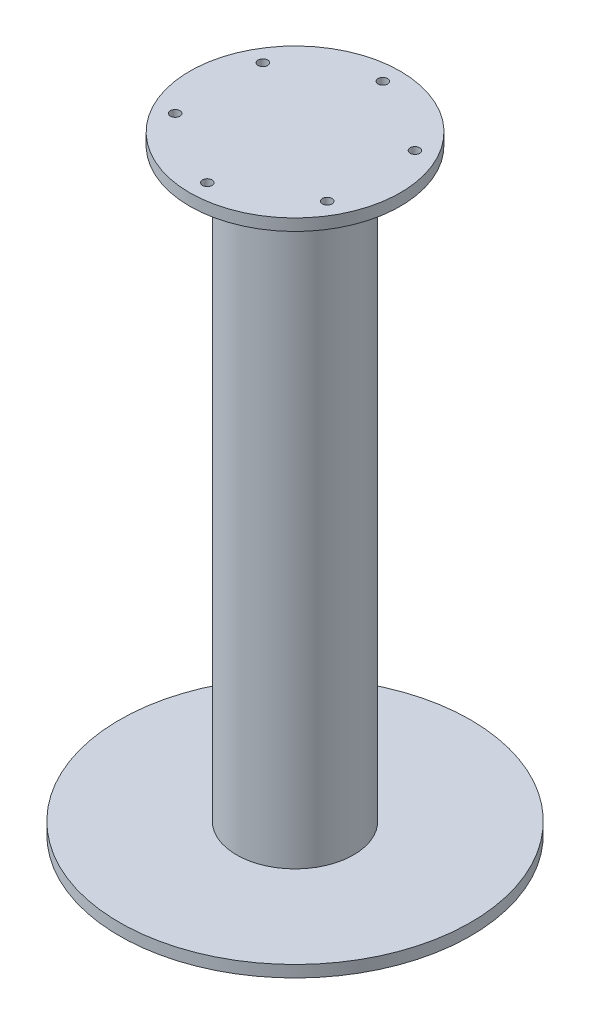
ISO-10303-21;
HEADER;
FILE_DESCRIPTION(('STEP AP214'),'2;1');
FILE_NAME('part.step','',(''),(''),'','','');
FILE_SCHEMA(('AUTOMOTIVE_DESIGN { 1 0 10303 214 1 1 1 1 }'));
ENDSEC;
DATA;
#1=APPLICATION_CONTEXT('core data for automotive mechanical design processes');
#2=APPLICATION_PROTOCOL_DEFINITION('international standard','automotive_design',2000,#1);
#3=PRODUCT_CONTEXT('',#1,'mechanical');
#4=PRODUCT('Part','Part','',(#3));
#5=PRODUCT_RELATED_PRODUCT_CATEGORY('part','',(#4));
#6=PRODUCT_DEFINITION_FORMATION('','',#4);
#7=PRODUCT_DEFINITION_CONTEXT('part definition',#1,'design');
#8=PRODUCT_DEFINITION('design','',#6,#7);
#9=PRODUCT_DEFINITION_SHAPE('','',#8);
#10=(LENGTH_UNIT() NAMED_UNIT(*) SI_UNIT(.MILLI.,.METRE.));
#11=(NAMED_UNIT(*) PLANE_ANGLE_UNIT() SI_UNIT($,.RADIAN.));
#12=(NAMED_UNIT(*) SI_UNIT($,.STERADIAN.) SOLID_ANGLE_UNIT());
#13=UNCERTAINTY_MEASURE_WITH_UNIT(LENGTH_MEASURE(1.E-05),#10,'distance_accuracy_value','');
#14=(GEOMETRIC_REPRESENTATION_CONTEXT(3) GLOBAL_UNCERTAINTY_ASSIGNED_CONTEXT((#13)) GLOBAL_UNIT_ASSIGNED_CONTEXT((#10,
#11,#12)) REPRESENTATION_CONTEXT('',''));
#15=CARTESIAN_POINT('',(0.,0.,0.));
#16=DIRECTION('',(0.,0.,1.));
#17=DIRECTION('',(1.,0.,0.));
#18=AXIS2_PLACEMENT_3D('',#15,#16,#17);
#19=CARTESIAN_POINT('',(0.,10.,0.));
#20=DIRECTION('',(0.,1.,0.));
#21=DIRECTION('',(0.,0.,1.));
#22=AXIS2_PLACEMENT_3D('',#19,#20,#21);
#23=PLANE('',#22);
#24=CARTESIAN_POINT('',(64.9519052838329,10.,-37.5));
#25=DIRECTION('',(0.,1.,0.));
#26=DIRECTION('',(0.,0.,1.));
#27=AXIS2_PLACEMENT_3D('',#24,#25,#26);
#28=CIRCLE('',#27,4.09999999999999);
#29=CARTESIAN_POINT('',(64.9519052838329,10.,-33.4));
#30=VERTEX_POINT('',#29);
#31=EDGE_CURVE('E57',#30,#30,#28,.T.);
#32=ORIENTED_EDGE('',*,*,#31,.F.);
#33=EDGE_LOOP('',(#32));
#34=FACE_BOUND('',#33,.T.);
#35=CARTESIAN_POINT('',(-64.9519052838329,10.,-37.5));
#36=DIRECTION('',(0.,1.,0.));
#37=DIRECTION('',(0.,0.,1.));
#38=AXIS2_PLACEMENT_3D('',#35,#36,#37);
#39=CIRCLE('',#38,4.09999999999999);
#40=CARTESIAN_POINT('',(-64.9519052838329,10.,-33.4));
#41=VERTEX_POINT('',#40);
#42=EDGE_CURVE('E69',#41,#41,#39,.T.);
#43=ORIENTED_EDGE('',*,*,#42,.F.);
#44=EDGE_LOOP('',(#43));
#45=FACE_BOUND('',#44,.T.);
#46=CARTESIAN_POINT('',(0.,10.,75.));
#47=DIRECTION('',(0.,1.,0.));
#48=DIRECTION('',(0.,0.,1.));
#49=AXIS2_PLACEMENT_3D('',#46,#47,#48);
#50=CIRCLE('',#49,4.1);
#51=CARTESIAN_POINT('',(0.,10.,79.1));
#52=VERTEX_POINT('',#51);
#53=EDGE_CURVE('E81',#52,#52,#50,.T.);
#54=ORIENTED_EDGE('',*,*,#53,.F.);
#55=EDGE_LOOP('',(#54));
#56=FACE_BOUND('',#55,.T.);
#57=CARTESIAN_POINT('',(0.,10.,0.));
#58=DIRECTION('',(0.,1.,0.));
#59=DIRECTION('',(0.,0.,1.));
#60=AXIS2_PLACEMENT_3D('',#57,#58,#59);
#61=CIRCLE('',#60,90.);
#62=CARTESIAN_POINT('',(0.,10.,90.));
#63=VERTEX_POINT('',#62);
#64=EDGE_CURVE('E41',#63,#63,#61,.T.);
#65=ORIENTED_EDGE('',*,*,#64,.T.);
#66=EDGE_LOOP('',(#65));
#67=FACE_BOUND('',#66,.T.);
#68=CARTESIAN_POINT('',(-64.9519052838329,10.,37.5));
#69=DIRECTION('',(0.,1.,0.));
#70=DIRECTION('',(0.,0.,1.));
#71=AXIS2_PLACEMENT_3D('',#68,#69,#70);
#72=CIRCLE('',#71,4.09999999999999);
#73=CARTESIAN_POINT('',(-64.9519052838329,10.,41.6));
#74=VERTEX_POINT('',#73);
#75=EDGE_CURVE('E75',#74,#74,#72,.T.);
#76=ORIENTED_EDGE('',*,*,#75,.F.);
#77=EDGE_LOOP('',(#76));
#78=FACE_BOUND('',#77,.T.);
#79=CARTESIAN_POINT('',(0.,10.,-75.));
#80=DIRECTION('',(0.,1.,0.));
#81=DIRECTION('',(0.,0.,1.));
#82=AXIS2_PLACEMENT_3D('',#79,#80,#81);
#83=CIRCLE('',#82,4.1);
#84=CARTESIAN_POINT('',(0.,10.,-70.9));
#85=VERTEX_POINT('',#84);
#86=EDGE_CURVE('E63',#85,#85,#83,.T.);
#87=ORIENTED_EDGE('',*,*,#86,.F.);
#88=EDGE_LOOP('',(#87));
#89=FACE_BOUND('',#88,.T.);
#90=CARTESIAN_POINT('',(64.9519052838329,10.,37.5));
#91=DIRECTION('',(0.,1.,0.));
#92=DIRECTION('',(0.,0.,1.));
#93=AXIS2_PLACEMENT_3D('',#90,#91,#92);
#94=CIRCLE('',#93,4.09999999999997);
#95=CARTESIAN_POINT('',(64.9519052838329,10.,41.5999999999999));
#96=VERTEX_POINT('',#95);
#97=EDGE_CURVE('E50',#96,#96,#94,.T.);
#98=ORIENTED_EDGE('',*,*,#97,.F.);
#99=EDGE_LOOP('',(#98));
#100=FACE_BOUND('',#99,.T.);
#101=ADVANCED_FACE('F33',(#34,#45,#56,#67,#78,#89,#100),#23,.T.);
#102=CARTESIAN_POINT('',(0.,0.,0.));
#103=DIRECTION('',(0.,1.,0.));
#104=DIRECTION('',(0.,0.,1.));
#105=AXIS2_PLACEMENT_3D('',#102,#103,#104);
#106=PLANE('',#105);
#107=CARTESIAN_POINT('',(0.,0.,0.));
#108=DIRECTION('',(0.,-1.,0.));
#109=DIRECTION('',(0.,0.,-1.));
#110=AXIS2_PLACEMENT_3D('',#107,#108,#109);
#111=CIRCLE('',#110,50.);
#112=CARTESIAN_POINT('',(0.,0.,-50.));
#113=VERTEX_POINT('',#112);
#114=EDGE_CURVE('E10',#113,#113,#111,.T.);
#115=ORIENTED_EDGE('',*,*,#114,.F.);
#116=EDGE_LOOP('',(#115));
#117=FACE_BOUND('',#116,.T.);
#118=CARTESIAN_POINT('',(0.,0.,0.));
#119=DIRECTION('',(0.,1.,0.));
#120=DIRECTION('',(0.,0.,1.));
#121=AXIS2_PLACEMENT_3D('',#118,#119,#120);
#122=CIRCLE('',#121,90.);
#123=CARTESIAN_POINT('',(0.,0.,90.));
#124=VERTEX_POINT('',#123);
#125=EDGE_CURVE('E37',#124,#124,#122,.T.);
#126=ORIENTED_EDGE('',*,*,#125,.F.);
#127=EDGE_LOOP('',(#126));
#128=FACE_BOUND('',#127,.T.);
#129=CARTESIAN_POINT('',(0.,0.,75.));
#130=DIRECTION('',(0.,1.,0.));
#131=DIRECTION('',(0.,0.,1.));
#132=AXIS2_PLACEMENT_3D('',#129,#130,#131);
#133=CIRCLE('',#132,4.1);
#134=CARTESIAN_POINT('',(0.,0.,79.1));
#135=VERTEX_POINT('',#134);
#136=EDGE_CURVE('E78',#135,#135,#133,.T.);
#137=ORIENTED_EDGE('',*,*,#136,.T.);
#138=EDGE_LOOP('',(#137));
#139=FACE_BOUND('',#138,.T.);
#140=CARTESIAN_POINT('',(-64.9519052838329,0.,37.5));
#141=DIRECTION('',(0.,1.,0.));
#142=DIRECTION('',(0.,0.,1.));
#143=AXIS2_PLACEMENT_3D('',#140,#141,#142);
#144=CIRCLE('',#143,4.09999999999999);
#145=CARTESIAN_POINT('',(-64.9519052838329,0.,41.6));
#146=VERTEX_POINT('',#145);
#147=EDGE_CURVE('E72',#146,#146,#144,.T.);
#148=ORIENTED_EDGE('',*,*,#147,.T.);
#149=EDGE_LOOP('',(#148));
#150=FACE_BOUND('',#149,.T.);
#151=CARTESIAN_POINT('',(-64.9519052838329,0.,-37.5));
#152=DIRECTION('',(0.,1.,0.));
#153=DIRECTION('',(0.,0.,1.));
#154=AXIS2_PLACEMENT_3D('',#151,#152,#153);
#155=CIRCLE('',#154,4.09999999999999);
#156=CARTESIAN_POINT('',(-64.9519052838329,0.,-33.4));
#157=VERTEX_POINT('',#156);
#158=EDGE_CURVE('E66',#157,#157,#155,.T.);
#159=ORIENTED_EDGE('',*,*,#158,.T.);
#160=EDGE_LOOP('',(#159));
#161=FACE_BOUND('',#160,.T.);
#162=CARTESIAN_POINT('',(0.,0.,-75.));
#163=DIRECTION('',(0.,1.,0.));
#164=DIRECTION('',(0.,0.,1.));
#165=AXIS2_PLACEMENT_3D('',#162,#163,#164);
#166=CIRCLE('',#165,4.1);
#167=CARTESIAN_POINT('',(0.,0.,-70.9));
#168=VERTEX_POINT('',#167);
#169=EDGE_CURVE('E60',#168,#168,#166,.T.);
#170=ORIENTED_EDGE('',*,*,#169,.T.);
#171=EDGE_LOOP('',(#170));
#172=FACE_BOUND('',#171,.T.);
#173=CARTESIAN_POINT('',(64.9519052838329,0.,-37.5));
#174=DIRECTION('',(0.,1.,0.));
#175=DIRECTION('',(0.,0.,1.));
#176=AXIS2_PLACEMENT_3D('',#173,#174,#175);
#177=CIRCLE('',#176,4.09999999999999);
#178=CARTESIAN_POINT('',(64.9519052838329,0.,-33.4));
#179=VERTEX_POINT('',#178);
#180=EDGE_CURVE('E53',#179,#179,#177,.T.);
#181=ORIENTED_EDGE('',*,*,#180,.T.);
#182=EDGE_LOOP('',(#181));
#183=FACE_BOUND('',#182,.T.);
#184=CARTESIAN_POINT('',(64.9519052838329,0.,37.5));
#185=DIRECTION('',(0.,1.,0.));
#186=DIRECTION('',(0.,0.,1.));
#187=AXIS2_PLACEMENT_3D('',#184,#185,#186);
#188=CIRCLE('',#187,4.09999999999997);
#189=CARTESIAN_POINT('',(64.9519052838329,0.,41.5999999999999));
#190=VERTEX_POINT('',#189);
#191=EDGE_CURVE('E54',#190,#190,#188,.T.);
#192=ORIENTED_EDGE('',*,*,#191,.T.);
#193=EDGE_LOOP('',(#192));
#194=FACE_BOUND('',#193,.T.);
#195=ADVANCED_FACE('F87',(#117,#128,#139,#150,#161,#172,#183,#194),#106,.F.);
#196=CARTESIAN_POINT('',(0.,10.,0.));
#197=DIRECTION('',(0.,-1.,0.));
#198=DIRECTION('',(0.,0.,-1.));
#199=AXIS2_PLACEMENT_3D('',#196,#197,#198);
#200=CYLINDRICAL_SURFACE('',#199,90.);
#201=ORIENTED_EDGE('',*,*,#64,.F.);
#202=EDGE_LOOP('',(#201));
#203=FACE_BOUND('',#202,.T.);
#204=ORIENTED_EDGE('',*,*,#125,.T.);
#205=EDGE_LOOP('',(#204));
#206=FACE_BOUND('',#205,.T.);
#207=ADVANCED_FACE('F35',(#203,#206),#200,.T.);
#208=CARTESIAN_POINT('',(0.,10.,75.));
#209=DIRECTION('',(0.,-1.,0.));
#210=DIRECTION('',(0.,0.,-1.));
#211=AXIS2_PLACEMENT_3D('',#208,#209,#210);
#212=CYLINDRICAL_SURFACE('',#211,4.1);
#213=ORIENTED_EDGE('',*,*,#53,.T.);
#214=EDGE_LOOP('',(#213));
#215=FACE_BOUND('',#214,.T.);
#216=ORIENTED_EDGE('',*,*,#136,.F.);
#217=EDGE_LOOP('',(#216));
#218=FACE_BOUND('',#217,.T.);
#219=ADVANCED_FACE('F90',(#215,#218),#212,.F.);
#220=CARTESIAN_POINT('',(-64.9519052838329,10.,37.5));
#221=DIRECTION('',(0.,-1.,0.));
#222=DIRECTION('',(0.,0.,-1.));
#223=AXIS2_PLACEMENT_3D('',#220,#221,#222);
#224=CYLINDRICAL_SURFACE('',#223,4.09999999999999);
#225=ORIENTED_EDGE('',*,*,#75,.T.);
#226=EDGE_LOOP('',(#225));
#227=FACE_BOUND('',#226,.T.);
#228=ORIENTED_EDGE('',*,*,#147,.F.);
#229=EDGE_LOOP('',(#228));
#230=FACE_BOUND('',#229,.T.);
#231=ADVANCED_FACE('F92',(#227,#230),#224,.F.);
#232=CARTESIAN_POINT('',(-64.9519052838329,10.,-37.5));
#233=DIRECTION('',(0.,-1.,0.));
#234=DIRECTION('',(0.,0.,-1.));
#235=AXIS2_PLACEMENT_3D('',#232,#233,#234);
#236=CYLINDRICAL_SURFACE('',#235,4.09999999999999);
#237=ORIENTED_EDGE('',*,*,#42,.T.);
#238=EDGE_LOOP('',(#237));
#239=FACE_BOUND('',#238,.T.);
#240=ORIENTED_EDGE('',*,*,#158,.F.);
#241=EDGE_LOOP('',(#240));
#242=FACE_BOUND('',#241,.T.);
#243=ADVANCED_FACE('F99',(#239,#242),#236,.F.);
#244=CARTESIAN_POINT('',(0.,10.,-75.));
#245=DIRECTION('',(0.,-1.,0.));
#246=DIRECTION('',(0.,0.,-1.));
#247=AXIS2_PLACEMENT_3D('',#244,#245,#246);
#248=CYLINDRICAL_SURFACE('',#247,4.1);
#249=ORIENTED_EDGE('',*,*,#86,.T.);
#250=EDGE_LOOP('',(#249));
#251=FACE_BOUND('',#250,.T.);
#252=ORIENTED_EDGE('',*,*,#169,.F.);
#253=EDGE_LOOP('',(#252));
#254=FACE_BOUND('',#253,.T.);
#255=ADVANCED_FACE('F139',(#251,#254),#248,.F.);
#256=CARTESIAN_POINT('',(64.9519052838329,10.,-37.5));
#257=DIRECTION('',(0.,-1.,0.));
#258=DIRECTION('',(0.,0.,-1.));
#259=AXIS2_PLACEMENT_3D('',#256,#257,#258);
#260=CYLINDRICAL_SURFACE('',#259,4.09999999999999);
#261=ORIENTED_EDGE('',*,*,#31,.T.);
#262=EDGE_LOOP('',(#261));
#263=FACE_BOUND('',#262,.T.);
#264=ORIENTED_EDGE('',*,*,#180,.F.);
#265=EDGE_LOOP('',(#264));
#266=FACE_BOUND('',#265,.T.);
#267=ADVANCED_FACE('F128',(#263,#266),#260,.F.);
#268=CARTESIAN_POINT('',(64.9519052838329,10.,37.5));
#269=DIRECTION('',(0.,-1.,0.));
#270=DIRECTION('',(0.,0.,-1.));
#271=AXIS2_PLACEMENT_3D('',#268,#269,#270);
#272=CYLINDRICAL_SURFACE('',#271,4.09999999999997);
#273=ORIENTED_EDGE('',*,*,#97,.T.);
#274=EDGE_LOOP('',(#273));
#275=FACE_BOUND('',#274,.T.);
#276=ORIENTED_EDGE('',*,*,#191,.F.);
#277=EDGE_LOOP('',(#276));
#278=FACE_BOUND('',#277,.T.);
#279=ADVANCED_FACE('F124',(#275,#278),#272,.F.);
#280=CARTESIAN_POINT('',(0.,-500.,0.));
#281=DIRECTION('',(0.,1.,0.));
#282=DIRECTION('',(0.,0.,1.));
#283=AXIS2_PLACEMENT_3D('',#280,#281,#282);
#284=CYLINDRICAL_SURFACE('',#283,50.);
#285=CARTESIAN_POINT('',(0.,-500.,0.));
#286=DIRECTION('',(0.,-1.,0.));
#287=DIRECTION('',(0.,0.,-1.));
#288=AXIS2_PLACEMENT_3D('',#285,#286,#287);
#289=CIRCLE('',#288,50.);
#290=CARTESIAN_POINT('',(0.,-500.,-50.));
#291=VERTEX_POINT('',#290);
#292=EDGE_CURVE('E48',#291,#291,#289,.T.);
#293=ORIENTED_EDGE('',*,*,#292,.F.);
#294=EDGE_LOOP('',(#293));
#295=FACE_BOUND('',#294,.T.);
#296=ORIENTED_EDGE('',*,*,#114,.T.);
#297=EDGE_LOOP('',(#296));
#298=FACE_BOUND('',#297,.T.);
#299=ADVANCED_FACE('F127',(#295,#298),#284,.T.);
#300=CARTESIAN_POINT('',(0.,-510.,0.));
#301=DIRECTION('',(0.,1.,0.));
#302=DIRECTION('',(0.,0.,1.));
#303=AXIS2_PLACEMENT_3D('',#300,#301,#302);
#304=CYLINDRICAL_SURFACE('',#303,150.);
#305=CARTESIAN_POINT('',(0.,-510.,0.));
#306=DIRECTION('',(0.,-1.,0.));
#307=DIRECTION('',(0.,0.,-1.));
#308=AXIS2_PLACEMENT_3D('',#305,#306,#307);
#309=CIRCLE('',#308,150.);
#310=CARTESIAN_POINT('',(0.,-510.,-150.));
#311=VERTEX_POINT('',#310);
#312=EDGE_CURVE('E227',#311,#311,#309,.T.);
#313=ORIENTED_EDGE('',*,*,#312,.F.);
#314=EDGE_LOOP('',(#313));
#315=FACE_BOUND('',#314,.T.);
#316=CARTESIAN_POINT('',(0.,-500.,0.));
#317=DIRECTION('',(0.,-1.,0.));
#318=DIRECTION('',(0.,0.,-1.));
#319=AXIS2_PLACEMENT_3D('',#316,#317,#318);
#320=CIRCLE('',#319,150.);
#321=CARTESIAN_POINT('',(0.,-500.,-150.));
#322=VERTEX_POINT('',#321);
#323=EDGE_CURVE('E225',#322,#322,#320,.T.);
#324=ORIENTED_EDGE('',*,*,#323,.T.);
#325=EDGE_LOOP('',(#324));
#326=FACE_BOUND('',#325,.T.);
#327=ADVANCED_FACE('F136',(#315,#326),#304,.T.);
#328=CARTESIAN_POINT('',(0.,-510.,0.));
#329=DIRECTION('',(0.,-1.,0.));
#330=DIRECTION('',(0.,0.,-1.));
#331=AXIS2_PLACEMENT_3D('',#328,#329,#330);
#332=PLANE('',#331);
#333=ORIENTED_EDGE('',*,*,#312,.T.);
#334=EDGE_LOOP('',(#333));
#335=FACE_BOUND('',#334,.T.);
#336=ADVANCED_FACE('F197',(#335),#332,.T.);
#337=CARTESIAN_POINT('',(0.,-500.,0.));
#338=DIRECTION('',(0.,-1.,0.));
#339=DIRECTION('',(0.,0.,-1.));
#340=AXIS2_PLACEMENT_3D('',#337,#338,#339);
#341=PLANE('',#340);
#342=ORIENTED_EDGE('',*,*,#292,.T.);
#343=EDGE_LOOP('',(#342));
#344=FACE_BOUND('',#343,.T.);
#345=ORIENTED_EDGE('',*,*,#323,.F.);
#346=EDGE_LOOP('',(#345));
#347=FACE_BOUND('',#346,.T.);
#348=ADVANCED_FACE('F206',(#344,#347),#341,.F.);
#349=CLOSED_SHELL('',(#101,#195,#207,#219,#231,#243,#255,#267,#279,#299,#327,#336,#348));
#350=MANIFOLD_SOLID_BREP('B2',#349);
#351=ADVANCED_BREP_SHAPE_REPRESENTATION('',(#18,#350),#14);
#352=SHAPE_DEFINITION_REPRESENTATION(#9,#351);
ENDSEC;
END-ISO-10303-21;
